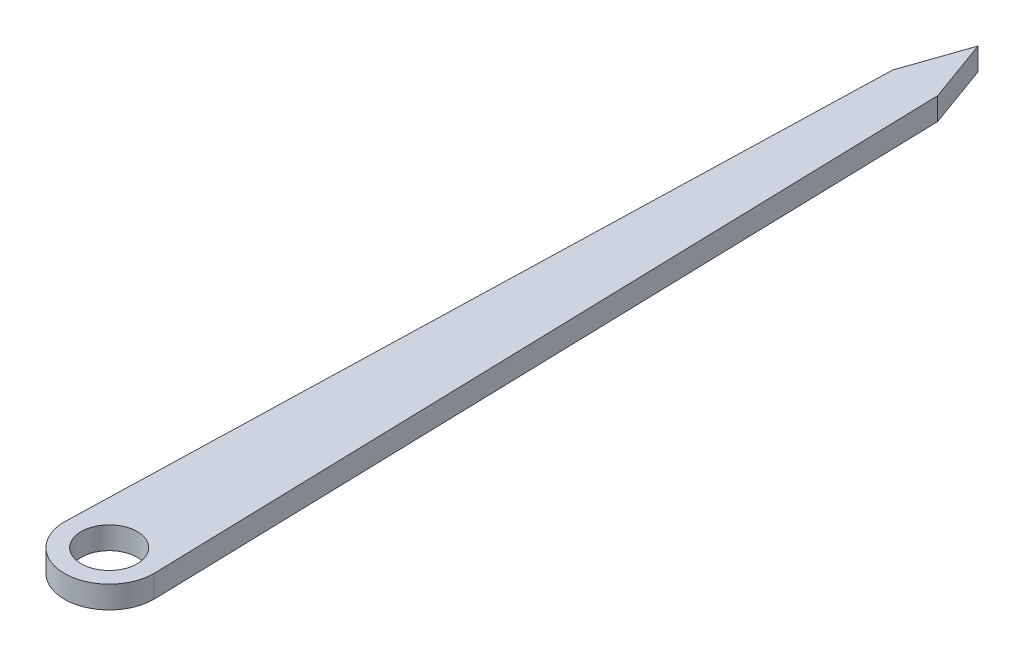
ISO-10303-21;
HEADER;
FILE_DESCRIPTION(('STEP AP214'),'2;1');
FILE_NAME('part.step','',(''),(''),'','','');
FILE_SCHEMA(('AUTOMOTIVE_DESIGN { 1 0 10303 214 1 1 1 1 }'));
ENDSEC;
DATA;
#1=APPLICATION_CONTEXT('core data for automotive mechanical design processes');
#2=APPLICATION_PROTOCOL_DEFINITION('international standard','automotive_design',2000,#1);
#3=PRODUCT_CONTEXT('',#1,'mechanical');
#4=PRODUCT('Part','Part','',(#3));
#5=PRODUCT_RELATED_PRODUCT_CATEGORY('part','',(#4));
#6=PRODUCT_DEFINITION_FORMATION('','',#4);
#7=PRODUCT_DEFINITION_CONTEXT('part definition',#1,'design');
#8=PRODUCT_DEFINITION('design','',#6,#7);
#9=PRODUCT_DEFINITION_SHAPE('','',#8);
#10=(LENGTH_UNIT() NAMED_UNIT(*) SI_UNIT(.MILLI.,.METRE.));
#11=(NAMED_UNIT(*) PLANE_ANGLE_UNIT() SI_UNIT($,.RADIAN.));
#12=(NAMED_UNIT(*) SI_UNIT($,.STERADIAN.) SOLID_ANGLE_UNIT());
#13=UNCERTAINTY_MEASURE_WITH_UNIT(LENGTH_MEASURE(1.E-05),#10,'distance_accuracy_value','');
#14=(GEOMETRIC_REPRESENTATION_CONTEXT(3) GLOBAL_UNCERTAINTY_ASSIGNED_CONTEXT((#13)) GLOBAL_UNIT_ASSIGNED_CONTEXT((#10,
#11,#12)) REPRESENTATION_CONTEXT('',''));
#15=CARTESIAN_POINT('',(0.,0.,0.));
#16=DIRECTION('',(0.,0.,1.));
#17=DIRECTION('',(1.,0.,0.));
#18=AXIS2_PLACEMENT_3D('',#15,#16,#17);
#19=CARTESIAN_POINT('',(104.951451368837,2.,2.97615330015618));
#20=DIRECTION('',(-0.999598170448803,0.,-0.028346033856704));
#21=DIRECTION('',(-0.028346033856704,0.,0.999598170448803));
#22=AXIS2_PLACEMENT_3D('',#19,#20,#21);
#23=PLANE('',#22);
#24=DIRECTION('',(0.028346033856704,0.,-0.999598170448803));
#25=VECTOR('',#24,1.);
#26=CARTESIAN_POINT('',(104.951451368837,0.,2.97615330015618));
#27=LINE('',#26,#25);
#28=CARTESIAN_POINT('',(106.,0.,-34.));
#29=VERTEX_POINT('',#28);
#30=CARTESIAN_POINT('',(108.040914437683,0.,-105.971068272314));
#31=VERTEX_POINT('',#30);
#32=EDGE_CURVE('E110',#29,#31,#27,.T.);
#33=ORIENTED_EDGE('',*,*,#32,.F.);
#34=DIRECTION('',(0.,-1.,0.));
#35=VECTOR('',#34,1.);
#36=CARTESIAN_POINT('',(106.,2.,-34.));
#37=LINE('',#36,#35);
#38=CARTESIAN_POINT('',(106.,2.,-34.));
#39=VERTEX_POINT('',#38);
#40=EDGE_CURVE('E11',#39,#29,#37,.T.);
#41=ORIENTED_EDGE('',*,*,#40,.F.);
#42=DIRECTION('',(0.028346033856704,0.,-0.999598170448803));
#43=VECTOR('',#42,1.);
#44=CARTESIAN_POINT('',(104.951451368837,2.,2.97615330015618));
#45=LINE('',#44,#43);
#46=CARTESIAN_POINT('',(108.040914437683,2.,-105.971068272314));
#47=VERTEX_POINT('',#46);
#48=EDGE_CURVE('E120',#39,#47,#45,.T.);
#49=ORIENTED_EDGE('',*,*,#48,.T.);
#50=DIRECTION('',(0.,-1.,0.));
#51=VECTOR('',#50,1.);
#52=CARTESIAN_POINT('',(108.040914437683,2.,-105.971068272314));
#53=LINE('',#52,#51);
#54=EDGE_CURVE('E52',#47,#31,#53,.T.);
#55=ORIENTED_EDGE('',*,*,#54,.T.);
#56=EDGE_LOOP('',(#33,#41,#49,#55));
#57=FACE_BOUND('',#56,.T.);
#58=ADVANCED_FACE('F35',(#57),#23,.T.);
#59=CARTESIAN_POINT('',(110.,2.,-34.));
#60=DIRECTION('',(0.,-1.,0.));
#61=DIRECTION('',(0.,0.,-1.));
#62=AXIS2_PLACEMENT_3D('',#59,#60,#61);
#63=CYLINDRICAL_SURFACE('',#62,3.99999999999999);
#64=CARTESIAN_POINT('',(110.,0.,-34.));
#65=DIRECTION('',(0.,1.,0.));
#66=DIRECTION('',(0.,0.,1.));
#67=AXIS2_PLACEMENT_3D('',#64,#65,#66);
#68=CIRCLE('',#67,3.99999999999999);
#69=CARTESIAN_POINT('',(114.,0.,-34.));
#70=VERTEX_POINT('',#69);
#71=EDGE_CURVE('E112',#29,#70,#68,.T.);
#72=ORIENTED_EDGE('',*,*,#71,.T.);
#73=DIRECTION('',(0.,-1.,0.));
#74=VECTOR('',#73,1.);
#75=CARTESIAN_POINT('',(114.,2.,-34.));
#76=LINE('',#75,#74);
#77=CARTESIAN_POINT('',(114.,2.,-34.));
#78=VERTEX_POINT('',#77);
#79=EDGE_CURVE('E44',#78,#70,#76,.T.);
#80=ORIENTED_EDGE('',*,*,#79,.F.);
#81=CARTESIAN_POINT('',(110.,2.,-34.));
#82=DIRECTION('',(0.,1.,0.));
#83=DIRECTION('',(0.,0.,1.));
#84=AXIS2_PLACEMENT_3D('',#81,#82,#83);
#85=CIRCLE('',#84,3.99999999999999);
#86=EDGE_CURVE('E91',#39,#78,#85,.T.);
#87=ORIENTED_EDGE('',*,*,#86,.F.);
#88=ORIENTED_EDGE('',*,*,#40,.T.);
#89=EDGE_LOOP('',(#72,#80,#87,#88));
#90=FACE_BOUND('',#89,.T.);
#91=ADVANCED_FACE('F140',(#90),#63,.T.);
#92=CARTESIAN_POINT('',(114.840100942145,2.,-3.12474421848353));
#93=DIRECTION('',(-0.999630026386503,0.,0.0271994548937866));
#94=DIRECTION('',(0.0271994548937866,0.,0.999630026386503));
#95=AXIS2_PLACEMENT_3D('',#92,#93,#94);
#96=PLANE('',#95);
#97=DIRECTION('',(-0.0271994548937866,0.,-0.999630026386503));
#98=VECTOR('',#97,1.);
#99=CARTESIAN_POINT('',(114.840100942145,0.,-3.12474421848353));
#100=LINE('',#99,#98);
#101=CARTESIAN_POINT('',(112.040914437683,0.,-106.));
#102=VERTEX_POINT('',#101);
#103=EDGE_CURVE('E100',#70,#102,#100,.T.);
#104=ORIENTED_EDGE('',*,*,#103,.T.);
#105=DIRECTION('',(0.,-1.,0.));
#106=VECTOR('',#105,1.);
#107=CARTESIAN_POINT('',(112.040914437683,2.,-106.));
#108=LINE('',#107,#106);
#109=CARTESIAN_POINT('',(112.040914437683,2.,-106.));
#110=VERTEX_POINT('',#109);
#111=EDGE_CURVE('E97',#110,#102,#108,.T.);
#112=ORIENTED_EDGE('',*,*,#111,.F.);
#113=DIRECTION('',(-0.0271994548937866,0.,-0.999630026386503));
#114=VECTOR('',#113,1.);
#115=CARTESIAN_POINT('',(114.840100942145,2.,-3.12474421848353));
#116=LINE('',#115,#114);
#117=EDGE_CURVE('E84',#78,#110,#116,.T.);
#118=ORIENTED_EDGE('',*,*,#117,.F.);
#119=ORIENTED_EDGE('',*,*,#79,.T.);
#120=EDGE_LOOP('',(#104,#112,#118,#119));
#121=FACE_BOUND('',#120,.T.);
#122=ADVANCED_FACE('F98',(#121),#96,.F.);
#123=CARTESIAN_POINT('',(132.983508734658,2.,-48.1030286521325));
#124=DIRECTION('',(-0.940370320938311,0.,0.340152406280447));
#125=DIRECTION('',(0.340152406280447,0.,0.940370320938311));
#126=AXIS2_PLACEMENT_3D('',#123,#124,#125);
#127=PLANE('',#126);
#128=DIRECTION('',(-0.340152406280447,0.,-0.940370320938311));
#129=VECTOR('',#128,1.);
#130=CARTESIAN_POINT('',(132.983508734658,0.,-48.1030286521325));
#131=LINE('',#130,#129);
#132=CARTESIAN_POINT('',(110.,0.,-111.64222192563));
#133=VERTEX_POINT('',#132);
#134=EDGE_CURVE('E115',#102,#133,#131,.T.);
#135=ORIENTED_EDGE('',*,*,#134,.T.);
#136=DIRECTION('',(0.,-1.,0.));
#137=VECTOR('',#136,1.);
#138=CARTESIAN_POINT('',(110.,2.,-111.64222192563));
#139=LINE('',#138,#137);
#140=CARTESIAN_POINT('',(110.,2.,-111.64222192563));
#141=VERTEX_POINT('',#140);
#142=EDGE_CURVE('E69',#141,#133,#139,.T.);
#143=ORIENTED_EDGE('',*,*,#142,.F.);
#144=DIRECTION('',(-0.340152406280447,0.,-0.940370320938311));
#145=VECTOR('',#144,1.);
#146=CARTESIAN_POINT('',(132.983508734658,2.,-48.1030286521325));
#147=LINE('',#146,#145);
#148=EDGE_CURVE('E90',#110,#141,#147,.T.);
#149=ORIENTED_EDGE('',*,*,#148,.F.);
#150=ORIENTED_EDGE('',*,*,#111,.T.);
#151=EDGE_LOOP('',(#135,#143,#149,#150));
#152=FACE_BOUND('',#151,.T.);
#153=ADVANCED_FACE('F104',(#152),#127,.F.);
#154=CARTESIAN_POINT('',(63.8178444198189,2.,22.0457115542929));
#155=DIRECTION('',(-0.945192275552673,0.,-0.326514260386219));
#156=DIRECTION('',(-0.326514260386219,0.,0.945192275552673));
#157=AXIS2_PLACEMENT_3D('',#154,#155,#156);
#158=PLANE('',#157);
#159=DIRECTION('',(0.326514260386219,0.,-0.945192275552673));
#160=VECTOR('',#159,1.);
#161=CARTESIAN_POINT('',(63.8178444198189,0.,22.0457115542929));
#162=LINE('',#161,#160);
#163=EDGE_CURVE('E117',#31,#133,#162,.T.);
#164=ORIENTED_EDGE('',*,*,#163,.F.);
#165=ORIENTED_EDGE('',*,*,#54,.F.);
#166=DIRECTION('',(0.326514260386219,0.,-0.945192275552673));
#167=VECTOR('',#166,1.);
#168=CARTESIAN_POINT('',(63.8178444198189,2.,22.0457115542929));
#169=LINE('',#168,#167);
#170=EDGE_CURVE('E105',#47,#141,#169,.T.);
#171=ORIENTED_EDGE('',*,*,#170,.T.);
#172=ORIENTED_EDGE('',*,*,#142,.T.);
#173=EDGE_LOOP('',(#164,#165,#171,#172));
#174=FACE_BOUND('',#173,.T.);
#175=ADVANCED_FACE('F127',(#174),#158,.T.);
#176=CARTESIAN_POINT('',(0.,2.,0.));
#177=DIRECTION('',(0.,1.,0.));
#178=DIRECTION('',(0.,0.,1.));
#179=AXIS2_PLACEMENT_3D('',#176,#177,#178);
#180=PLANE('',#179);
#181=CARTESIAN_POINT('',(110.,2.,-34.));
#182=DIRECTION('',(0.,1.,0.));
#183=DIRECTION('',(0.,0.,1.));
#184=AXIS2_PLACEMENT_3D('',#181,#182,#183);
#185=CIRCLE('',#184,2.50000000000001);
#186=CARTESIAN_POINT('',(110.,2.,-31.5));
#187=VERTEX_POINT('',#186);
#188=EDGE_CURVE('E150',#187,#187,#185,.T.);
#189=ORIENTED_EDGE('',*,*,#188,.F.);
#190=EDGE_LOOP('',(#189));
#191=FACE_BOUND('',#190,.T.);
#192=ORIENTED_EDGE('',*,*,#48,.F.);
#193=ORIENTED_EDGE('',*,*,#86,.T.);
#194=ORIENTED_EDGE('',*,*,#117,.T.);
#195=ORIENTED_EDGE('',*,*,#148,.T.);
#196=ORIENTED_EDGE('',*,*,#170,.F.);
#197=EDGE_LOOP('',(#192,#193,#194,#195,#196));
#198=FACE_BOUND('',#197,.T.);
#199=ADVANCED_FACE('F87',(#191,#198),#180,.T.);
#200=CARTESIAN_POINT('',(0.,0.,0.));
#201=DIRECTION('',(0.,1.,0.));
#202=DIRECTION('',(0.,0.,1.));
#203=AXIS2_PLACEMENT_3D('',#200,#201,#202);
#204=PLANE('',#203);
#205=CARTESIAN_POINT('',(110.,0.,-34.));
#206=DIRECTION('',(0.,1.,0.));
#207=DIRECTION('',(0.,0.,1.));
#208=AXIS2_PLACEMENT_3D('',#205,#206,#207);
#209=CIRCLE('',#208,2.50000000000001);
#210=CARTESIAN_POINT('',(110.,0.,-31.5));
#211=VERTEX_POINT('',#210);
#212=EDGE_CURVE('E38',#211,#211,#209,.T.);
#213=ORIENTED_EDGE('',*,*,#212,.T.);
#214=EDGE_LOOP('',(#213));
#215=FACE_BOUND('',#214,.T.);
#216=ORIENTED_EDGE('',*,*,#32,.T.);
#217=ORIENTED_EDGE('',*,*,#163,.T.);
#218=ORIENTED_EDGE('',*,*,#134,.F.);
#219=ORIENTED_EDGE('',*,*,#103,.F.);
#220=ORIENTED_EDGE('',*,*,#71,.F.);
#221=EDGE_LOOP('',(#216,#217,#218,#219,#220));
#222=FACE_BOUND('',#221,.T.);
#223=ADVANCED_FACE('F126',(#215,#222),#204,.F.);
#224=CARTESIAN_POINT('',(110.,-16.,-34.));
#225=DIRECTION('',(0.,1.,0.));
#226=DIRECTION('',(0.,0.,1.));
#227=AXIS2_PLACEMENT_3D('',#224,#225,#226);
#228=CYLINDRICAL_SURFACE('',#227,2.50000000000001);
#229=ORIENTED_EDGE('',*,*,#188,.T.);
#230=EDGE_LOOP('',(#229));
#231=FACE_BOUND('',#230,.T.);
#232=ORIENTED_EDGE('',*,*,#212,.F.);
#233=EDGE_LOOP('',(#232));
#234=FACE_BOUND('',#233,.T.);
#235=ADVANCED_FACE('F158',(#231,#234),#228,.F.);
#236=CLOSED_SHELL('',(#58,#91,#122,#153,#175,#199,#223,#235));
#237=MANIFOLD_SOLID_BREP('B2',#236);
#238=ADVANCED_BREP_SHAPE_REPRESENTATION('',(#18,#237),#14);
#239=SHAPE_DEFINITION_REPRESENTATION(#9,#238);
ENDSEC;
END-ISO-10303-21;
